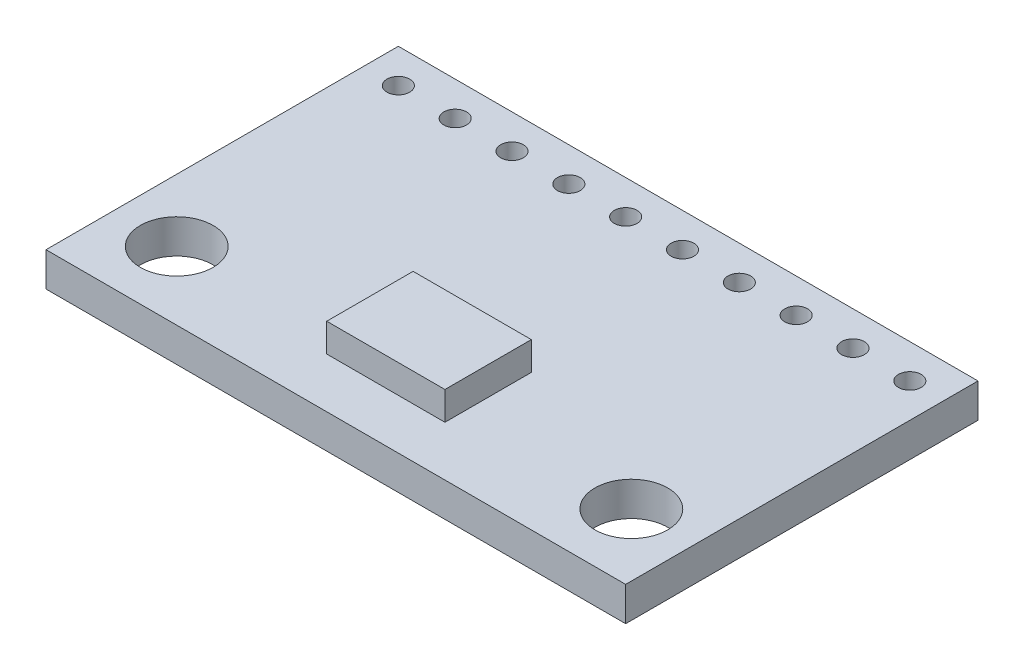
ISO-10303-21;
HEADER;
FILE_DESCRIPTION(('STEP AP214'),'2;1');
FILE_NAME('part.step','',(''),(''),'','','');
FILE_SCHEMA(('AUTOMOTIVE_DESIGN { 1 0 10303 214 1 1 1 1 }'));
ENDSEC;
DATA;
#1=APPLICATION_CONTEXT('core data for automotive mechanical design processes');
#2=APPLICATION_PROTOCOL_DEFINITION('international standard','automotive_design',2000,#1);
#3=PRODUCT_CONTEXT('',#1,'mechanical');
#4=PRODUCT('Part','Part','',(#3));
#5=PRODUCT_RELATED_PRODUCT_CATEGORY('part','',(#4));
#6=PRODUCT_DEFINITION_FORMATION('','',#4);
#7=PRODUCT_DEFINITION_CONTEXT('part definition',#1,'design');
#8=PRODUCT_DEFINITION('design','',#6,#7);
#9=PRODUCT_DEFINITION_SHAPE('','',#8);
#10=(LENGTH_UNIT() NAMED_UNIT(*) SI_UNIT(.MILLI.,.METRE.));
#11=(NAMED_UNIT(*) PLANE_ANGLE_UNIT() SI_UNIT($,.RADIAN.));
#12=(NAMED_UNIT(*) SI_UNIT($,.STERADIAN.) SOLID_ANGLE_UNIT());
#13=UNCERTAINTY_MEASURE_WITH_UNIT(LENGTH_MEASURE(1.E-05),#10,'distance_accuracy_value','');
#14=(GEOMETRIC_REPRESENTATION_CONTEXT(3) GLOBAL_UNCERTAINTY_ASSIGNED_CONTEXT((#13)) GLOBAL_UNIT_ASSIGNED_CONTEXT((#10,
#11,#12)) REPRESENTATION_CONTEXT('',''));
#15=CARTESIAN_POINT('',(0.,0.,0.));
#16=DIRECTION('',(0.,0.,1.));
#17=DIRECTION('',(1.,0.,0.));
#18=AXIS2_PLACEMENT_3D('',#15,#16,#17);
#19=CARTESIAN_POINT('',(0.,1.5,0.));
#20=DIRECTION('',(0.,1.,0.));
#21=DIRECTION('',(0.,0.,1.));
#22=AXIS2_PLACEMENT_3D('',#19,#20,#21);
#23=PLANE('',#22);
#24=CARTESIAN_POINT('',(11.25,1.5,-6.25));
#25=DIRECTION('',(0.,1.,0.));
#26=DIRECTION('',(0.,0.,1.));
#27=AXIS2_PLACEMENT_3D('',#24,#25,#26);
#28=CIRCLE('',#27,0.500000000000001);
#29=CARTESIAN_POINT('',(11.25,1.5,-5.75));
#30=VERTEX_POINT('',#29);
#31=EDGE_CURVE('E268',#30,#30,#28,.T.);
#32=ORIENTED_EDGE('',*,*,#31,.F.);
#33=EDGE_LOOP('',(#32));
#34=FACE_BOUND('',#33,.T.);
#35=CARTESIAN_POINT('',(8.75,1.5,-6.25));
#36=DIRECTION('',(0.,1.,0.));
#37=DIRECTION('',(0.,0.,1.));
#38=AXIS2_PLACEMENT_3D('',#35,#36,#37);
#39=CIRCLE('',#38,0.500000000000001);
#40=CARTESIAN_POINT('',(8.75,1.5,-5.75));
#41=VERTEX_POINT('',#40);
#42=EDGE_CURVE('E272',#41,#41,#39,.T.);
#43=ORIENTED_EDGE('',*,*,#42,.F.);
#44=EDGE_LOOP('',(#43));
#45=FACE_BOUND('',#44,.T.);
#46=CARTESIAN_POINT('',(6.25,1.5,-6.25));
#47=DIRECTION('',(0.,1.,0.));
#48=DIRECTION('',(0.,0.,1.));
#49=AXIS2_PLACEMENT_3D('',#46,#47,#48);
#50=CIRCLE('',#49,0.500000000000001);
#51=CARTESIAN_POINT('',(6.25,1.5,-5.75));
#52=VERTEX_POINT('',#51);
#53=EDGE_CURVE('E281',#52,#52,#50,.T.);
#54=ORIENTED_EDGE('',*,*,#53,.F.);
#55=EDGE_LOOP('',(#54));
#56=FACE_BOUND('',#55,.T.);
#57=CARTESIAN_POINT('',(3.75,1.5,-6.25));
#58=DIRECTION('',(0.,1.,0.));
#59=DIRECTION('',(0.,0.,1.));
#60=AXIS2_PLACEMENT_3D('',#57,#58,#59);
#61=CIRCLE('',#60,0.500000000000001);
#62=CARTESIAN_POINT('',(3.75,1.5,-5.75));
#63=VERTEX_POINT('',#62);
#64=EDGE_CURVE('E287',#63,#63,#61,.T.);
#65=ORIENTED_EDGE('',*,*,#64,.F.);
#66=EDGE_LOOP('',(#65));
#67=FACE_BOUND('',#66,.T.);
#68=CARTESIAN_POINT('',(1.25,1.5,-6.25));
#69=DIRECTION('',(0.,1.,0.));
#70=DIRECTION('',(0.,0.,1.));
#71=AXIS2_PLACEMENT_3D('',#68,#69,#70);
#72=CIRCLE('',#71,0.500000000000001);
#73=CARTESIAN_POINT('',(1.25,1.5,-5.75));
#74=VERTEX_POINT('',#73);
#75=EDGE_CURVE('E293',#74,#74,#72,.T.);
#76=ORIENTED_EDGE('',*,*,#75,.F.);
#77=EDGE_LOOP('',(#76));
#78=FACE_BOUND('',#77,.T.);
#79=CARTESIAN_POINT('',(-1.25,1.5,-6.25));
#80=DIRECTION('',(0.,1.,0.));
#81=DIRECTION('',(0.,0.,1.));
#82=AXIS2_PLACEMENT_3D('',#79,#80,#81);
#83=CIRCLE('',#82,0.500000000000001);
#84=CARTESIAN_POINT('',(-1.25,1.5,-5.75));
#85=VERTEX_POINT('',#84);
#86=EDGE_CURVE('E299',#85,#85,#83,.T.);
#87=ORIENTED_EDGE('',*,*,#86,.F.);
#88=EDGE_LOOP('',(#87));
#89=FACE_BOUND('',#88,.T.);
#90=CARTESIAN_POINT('',(-3.75,1.5,-6.25));
#91=DIRECTION('',(0.,1.,0.));
#92=DIRECTION('',(0.,0.,1.));
#93=AXIS2_PLACEMENT_3D('',#90,#91,#92);
#94=CIRCLE('',#93,0.500000000000001);
#95=CARTESIAN_POINT('',(-3.75,1.5,-5.75));
#96=VERTEX_POINT('',#95);
#97=EDGE_CURVE('E305',#96,#96,#94,.T.);
#98=ORIENTED_EDGE('',*,*,#97,.F.);
#99=EDGE_LOOP('',(#98));
#100=FACE_BOUND('',#99,.T.);
#101=CARTESIAN_POINT('',(-6.25,1.5,-6.25));
#102=DIRECTION('',(0.,1.,0.));
#103=DIRECTION('',(0.,0.,1.));
#104=AXIS2_PLACEMENT_3D('',#101,#102,#103);
#105=CIRCLE('',#104,0.500000000000001);
#106=CARTESIAN_POINT('',(-6.25,1.5,-5.75));
#107=VERTEX_POINT('',#106);
#108=EDGE_CURVE('E311',#107,#107,#105,.T.);
#109=ORIENTED_EDGE('',*,*,#108,.F.);
#110=EDGE_LOOP('',(#109));
#111=FACE_BOUND('',#110,.T.);
#112=CARTESIAN_POINT('',(-8.75,1.5,-6.25));
#113=DIRECTION('',(0.,1.,0.));
#114=DIRECTION('',(0.,0.,1.));
#115=AXIS2_PLACEMENT_3D('',#112,#113,#114);
#116=CIRCLE('',#115,0.500000000000001);
#117=CARTESIAN_POINT('',(-8.75,1.5,-5.75));
#118=VERTEX_POINT('',#117);
#119=EDGE_CURVE('E317',#118,#118,#116,.T.);
#120=ORIENTED_EDGE('',*,*,#119,.F.);
#121=EDGE_LOOP('',(#120));
#122=FACE_BOUND('',#121,.T.);
#123=CARTESIAN_POINT('',(-11.25,1.5,-6.25));
#124=DIRECTION('',(0.,1.,0.));
#125=DIRECTION('',(0.,0.,1.));
#126=AXIS2_PLACEMENT_3D('',#123,#124,#125);
#127=CIRCLE('',#126,0.500000000000001);
#128=CARTESIAN_POINT('',(-11.25,1.5,-5.75));
#129=VERTEX_POINT('',#128);
#130=EDGE_CURVE('E320',#129,#129,#127,.T.);
#131=ORIENTED_EDGE('',*,*,#130,.F.);
#132=EDGE_LOOP('',(#131));
#133=FACE_BOUND('',#132,.T.);
#134=CARTESIAN_POINT('',(-10.,1.5,4.75));
#135=DIRECTION('',(0.,1.,0.));
#136=DIRECTION('',(0.,0.,1.));
#137=AXIS2_PLACEMENT_3D('',#134,#135,#136);
#138=CIRCLE('',#137,1.6);
#139=CARTESIAN_POINT('',(-10.,1.5,6.35));
#140=VERTEX_POINT('',#139);
#141=EDGE_CURVE('E147',#140,#140,#138,.T.);
#142=ORIENTED_EDGE('',*,*,#141,.F.);
#143=EDGE_LOOP('',(#142));
#144=FACE_BOUND('',#143,.T.);
#145=DIRECTION('',(0.,0.,-1.));
#146=VECTOR('',#145,1.);
#147=CARTESIAN_POINT('',(12.75,1.5,-7.75));
#148=LINE('',#147,#146);
#149=CARTESIAN_POINT('',(12.75,1.5,7.75));
#150=VERTEX_POINT('',#149);
#151=CARTESIAN_POINT('',(12.75,1.5,-7.75));
#152=VERTEX_POINT('',#151);
#153=EDGE_CURVE('E153',#150,#152,#148,.T.);
#154=ORIENTED_EDGE('',*,*,#153,.T.);
#155=DIRECTION('',(-1.,0.,0.));
#156=VECTOR('',#155,1.);
#157=CARTESIAN_POINT('',(-12.75,1.5,-7.75));
#158=LINE('',#157,#156);
#159=CARTESIAN_POINT('',(-12.75,1.5,-7.75));
#160=VERTEX_POINT('',#159);
#161=EDGE_CURVE('E89',#152,#160,#158,.T.);
#162=ORIENTED_EDGE('',*,*,#161,.T.);
#163=DIRECTION('',(0.,0.,1.));
#164=VECTOR('',#163,1.);
#165=CARTESIAN_POINT('',(-12.75,1.5,-7.75));
#166=LINE('',#165,#164);
#167=CARTESIAN_POINT('',(-12.75,1.5,7.75));
#168=VERTEX_POINT('',#167);
#169=EDGE_CURVE('E156',#160,#168,#166,.T.);
#170=ORIENTED_EDGE('',*,*,#169,.T.);
#171=DIRECTION('',(1.,0.,0.));
#172=VECTOR('',#171,1.);
#173=CARTESIAN_POINT('',(-12.75,1.5,7.75));
#174=LINE('',#173,#172);
#175=EDGE_CURVE('E61',#168,#150,#174,.T.);
#176=ORIENTED_EDGE('',*,*,#175,.T.);
#177=EDGE_LOOP('',(#154,#162,#170,#176));
#178=FACE_BOUND('',#177,.T.);
#179=CARTESIAN_POINT('',(10.,1.5,4.75));
#180=DIRECTION('',(0.,1.,0.));
#181=DIRECTION('',(0.,0.,1.));
#182=AXIS2_PLACEMENT_3D('',#179,#180,#181);
#183=CIRCLE('',#182,1.6);
#184=CARTESIAN_POINT('',(10.,1.5,6.35));
#185=VERTEX_POINT('',#184);
#186=EDGE_CURVE('E139',#185,#185,#183,.T.);
#187=ORIENTED_EDGE('',*,*,#186,.F.);
#188=EDGE_LOOP('',(#187));
#189=FACE_BOUND('',#188,.T.);
#190=DIRECTION('',(-1.,0.,0.));
#191=VECTOR('',#190,1.);
#192=CARTESIAN_POINT('',(-2.6,1.5,1.75));
#193=LINE('',#192,#191);
#194=CARTESIAN_POINT('',(2.6,1.5,1.75));
#195=VERTEX_POINT('',#194);
#196=CARTESIAN_POINT('',(-2.6,1.5,1.75));
#197=VERTEX_POINT('',#196);
#198=EDGE_CURVE('E330',#195,#197,#193,.T.);
#199=ORIENTED_EDGE('',*,*,#198,.F.);
#200=DIRECTION('',(0.,0.,-1.));
#201=VECTOR('',#200,1.);
#202=CARTESIAN_POINT('',(2.6,1.5,1.75));
#203=LINE('',#202,#201);
#204=CARTESIAN_POINT('',(2.6,1.5,5.55));
#205=VERTEX_POINT('',#204);
#206=EDGE_CURVE('E134',#205,#195,#203,.T.);
#207=ORIENTED_EDGE('',*,*,#206,.F.);
#208=DIRECTION('',(1.,0.,0.));
#209=VECTOR('',#208,1.);
#210=CARTESIAN_POINT('',(-2.6,1.5,5.55));
#211=LINE('',#210,#209);
#212=CARTESIAN_POINT('',(-2.6,1.5,5.55));
#213=VERTEX_POINT('',#212);
#214=EDGE_CURVE('E130',#213,#205,#211,.T.);
#215=ORIENTED_EDGE('',*,*,#214,.F.);
#216=DIRECTION('',(0.,0.,1.));
#217=VECTOR('',#216,1.);
#218=CARTESIAN_POINT('',(-2.6,1.5,1.75));
#219=LINE('',#218,#217);
#220=EDGE_CURVE('E332',#197,#213,#219,.T.);
#221=ORIENTED_EDGE('',*,*,#220,.F.);
#222=EDGE_LOOP('',(#199,#207,#215,#221));
#223=FACE_BOUND('',#222,.T.);
#224=ADVANCED_FACE('F37',(#34,#45,#56,#67,#78,#89,#100,#111,#122,#133,#144,#178,#189,#223),#23,.T.);
#225=CARTESIAN_POINT('',(0.,0.,0.));
#226=DIRECTION('',(0.,1.,0.));
#227=DIRECTION('',(0.,0.,1.));
#228=AXIS2_PLACEMENT_3D('',#225,#226,#227);
#229=PLANE('',#228);
#230=CARTESIAN_POINT('',(11.25,0.,-6.25));
#231=DIRECTION('',(0.,1.,0.));
#232=DIRECTION('',(0.,0.,1.));
#233=AXIS2_PLACEMENT_3D('',#230,#231,#232);
#234=CIRCLE('',#233,0.500000000000001);
#235=CARTESIAN_POINT('',(11.25,0.,-5.75));
#236=VERTEX_POINT('',#235);
#237=EDGE_CURVE('E266',#236,#236,#234,.T.);
#238=ORIENTED_EDGE('',*,*,#237,.T.);
#239=EDGE_LOOP('',(#238));
#240=FACE_BOUND('',#239,.T.);
#241=CARTESIAN_POINT('',(8.75,0.,-6.25));
#242=DIRECTION('',(0.,1.,0.));
#243=DIRECTION('',(0.,0.,1.));
#244=AXIS2_PLACEMENT_3D('',#241,#242,#243);
#245=CIRCLE('',#244,0.500000000000001);
#246=CARTESIAN_POINT('',(8.75,0.,-5.75));
#247=VERTEX_POINT('',#246);
#248=EDGE_CURVE('E269',#247,#247,#245,.T.);
#249=ORIENTED_EDGE('',*,*,#248,.T.);
#250=EDGE_LOOP('',(#249));
#251=FACE_BOUND('',#250,.T.);
#252=CARTESIAN_POINT('',(6.25,0.,-6.25));
#253=DIRECTION('',(0.,1.,0.));
#254=DIRECTION('',(0.,0.,1.));
#255=AXIS2_PLACEMENT_3D('',#252,#253,#254);
#256=CIRCLE('',#255,0.500000000000001);
#257=CARTESIAN_POINT('',(6.25,0.,-5.75));
#258=VERTEX_POINT('',#257);
#259=EDGE_CURVE('E278',#258,#258,#256,.T.);
#260=ORIENTED_EDGE('',*,*,#259,.T.);
#261=EDGE_LOOP('',(#260));
#262=FACE_BOUND('',#261,.T.);
#263=CARTESIAN_POINT('',(3.75,0.,-6.25));
#264=DIRECTION('',(0.,1.,0.));
#265=DIRECTION('',(0.,0.,1.));
#266=AXIS2_PLACEMENT_3D('',#263,#264,#265);
#267=CIRCLE('',#266,0.500000000000001);
#268=CARTESIAN_POINT('',(3.75,0.,-5.75));
#269=VERTEX_POINT('',#268);
#270=EDGE_CURVE('E284',#269,#269,#267,.T.);
#271=ORIENTED_EDGE('',*,*,#270,.T.);
#272=EDGE_LOOP('',(#271));
#273=FACE_BOUND('',#272,.T.);
#274=CARTESIAN_POINT('',(1.25,0.,-6.25));
#275=DIRECTION('',(0.,1.,0.));
#276=DIRECTION('',(0.,0.,1.));
#277=AXIS2_PLACEMENT_3D('',#274,#275,#276);
#278=CIRCLE('',#277,0.500000000000001);
#279=CARTESIAN_POINT('',(1.25,0.,-5.75));
#280=VERTEX_POINT('',#279);
#281=EDGE_CURVE('E290',#280,#280,#278,.T.);
#282=ORIENTED_EDGE('',*,*,#281,.T.);
#283=EDGE_LOOP('',(#282));
#284=FACE_BOUND('',#283,.T.);
#285=CARTESIAN_POINT('',(-1.25,0.,-6.25));
#286=DIRECTION('',(0.,1.,0.));
#287=DIRECTION('',(0.,0.,1.));
#288=AXIS2_PLACEMENT_3D('',#285,#286,#287);
#289=CIRCLE('',#288,0.500000000000001);
#290=CARTESIAN_POINT('',(-1.25,0.,-5.75));
#291=VERTEX_POINT('',#290);
#292=EDGE_CURVE('E296',#291,#291,#289,.T.);
#293=ORIENTED_EDGE('',*,*,#292,.T.);
#294=EDGE_LOOP('',(#293));
#295=FACE_BOUND('',#294,.T.);
#296=CARTESIAN_POINT('',(-3.75,0.,-6.25));
#297=DIRECTION('',(0.,1.,0.));
#298=DIRECTION('',(0.,0.,1.));
#299=AXIS2_PLACEMENT_3D('',#296,#297,#298);
#300=CIRCLE('',#299,0.500000000000001);
#301=CARTESIAN_POINT('',(-3.75,0.,-5.75));
#302=VERTEX_POINT('',#301);
#303=EDGE_CURVE('E302',#302,#302,#300,.T.);
#304=ORIENTED_EDGE('',*,*,#303,.T.);
#305=EDGE_LOOP('',(#304));
#306=FACE_BOUND('',#305,.T.);
#307=CARTESIAN_POINT('',(-6.25,0.,-6.25));
#308=DIRECTION('',(0.,1.,0.));
#309=DIRECTION('',(0.,0.,1.));
#310=AXIS2_PLACEMENT_3D('',#307,#308,#309);
#311=CIRCLE('',#310,0.500000000000001);
#312=CARTESIAN_POINT('',(-6.25,0.,-5.75));
#313=VERTEX_POINT('',#312);
#314=EDGE_CURVE('E308',#313,#313,#311,.T.);
#315=ORIENTED_EDGE('',*,*,#314,.T.);
#316=EDGE_LOOP('',(#315));
#317=FACE_BOUND('',#316,.T.);
#318=CARTESIAN_POINT('',(-8.75,0.,-6.25));
#319=DIRECTION('',(0.,1.,0.));
#320=DIRECTION('',(0.,0.,1.));
#321=AXIS2_PLACEMENT_3D('',#318,#319,#320);
#322=CIRCLE('',#321,0.500000000000001);
#323=CARTESIAN_POINT('',(-8.75,0.,-5.75));
#324=VERTEX_POINT('',#323);
#325=EDGE_CURVE('E314',#324,#324,#322,.T.);
#326=ORIENTED_EDGE('',*,*,#325,.T.);
#327=EDGE_LOOP('',(#326));
#328=FACE_BOUND('',#327,.T.);
#329=CARTESIAN_POINT('',(-11.25,0.,-6.25));
#330=DIRECTION('',(0.,1.,0.));
#331=DIRECTION('',(0.,0.,1.));
#332=AXIS2_PLACEMENT_3D('',#329,#330,#331);
#333=CIRCLE('',#332,0.500000000000001);
#334=CARTESIAN_POINT('',(-11.25,0.,-5.75));
#335=VERTEX_POINT('',#334);
#336=EDGE_CURVE('E321',#335,#335,#333,.T.);
#337=ORIENTED_EDGE('',*,*,#336,.T.);
#338=EDGE_LOOP('',(#337));
#339=FACE_BOUND('',#338,.T.);
#340=DIRECTION('',(0.,0.,-1.));
#341=VECTOR('',#340,1.);
#342=CARTESIAN_POINT('',(12.75,0.,-7.75));
#343=LINE('',#342,#341);
#344=CARTESIAN_POINT('',(12.75,0.,7.75));
#345=VERTEX_POINT('',#344);
#346=CARTESIAN_POINT('',(12.75,0.,-7.75));
#347=VERTEX_POINT('',#346);
#348=EDGE_CURVE('E150',#345,#347,#343,.T.);
#349=ORIENTED_EDGE('',*,*,#348,.F.);
#350=DIRECTION('',(1.,0.,0.));
#351=VECTOR('',#350,1.);
#352=CARTESIAN_POINT('',(-12.75,0.,7.75));
#353=LINE('',#352,#351);
#354=CARTESIAN_POINT('',(-12.75,0.,7.75));
#355=VERTEX_POINT('',#354);
#356=EDGE_CURVE('E82',#355,#345,#353,.T.);
#357=ORIENTED_EDGE('',*,*,#356,.F.);
#358=DIRECTION('',(0.,0.,1.));
#359=VECTOR('',#358,1.);
#360=CARTESIAN_POINT('',(-12.75,0.,-7.75));
#361=LINE('',#360,#359);
#362=CARTESIAN_POINT('',(-12.75,0.,-7.75));
#363=VERTEX_POINT('',#362);
#364=EDGE_CURVE('E164',#363,#355,#361,.T.);
#365=ORIENTED_EDGE('',*,*,#364,.F.);
#366=DIRECTION('',(-1.,0.,0.));
#367=VECTOR('',#366,1.);
#368=CARTESIAN_POINT('',(-12.75,0.,-7.75));
#369=LINE('',#368,#367);
#370=EDGE_CURVE('E162',#347,#363,#369,.T.);
#371=ORIENTED_EDGE('',*,*,#370,.F.);
#372=EDGE_LOOP('',(#349,#357,#365,#371));
#373=FACE_BOUND('',#372,.T.);
#374=CARTESIAN_POINT('',(-10.,0.,4.75));
#375=DIRECTION('',(0.,1.,0.));
#376=DIRECTION('',(0.,0.,1.));
#377=AXIS2_PLACEMENT_3D('',#374,#375,#376);
#378=CIRCLE('',#377,1.6);
#379=CARTESIAN_POINT('',(-10.,0.,6.35));
#380=VERTEX_POINT('',#379);
#381=EDGE_CURVE('E145',#380,#380,#378,.T.);
#382=ORIENTED_EDGE('',*,*,#381,.T.);
#383=EDGE_LOOP('',(#382));
#384=FACE_BOUND('',#383,.T.);
#385=CARTESIAN_POINT('',(10.,0.,4.75));
#386=DIRECTION('',(0.,1.,0.));
#387=DIRECTION('',(0.,0.,1.));
#388=AXIS2_PLACEMENT_3D('',#385,#386,#387);
#389=CIRCLE('',#388,1.6);
#390=CARTESIAN_POINT('',(10.,0.,6.35));
#391=VERTEX_POINT('',#390);
#392=EDGE_CURVE('E136',#391,#391,#389,.T.);
#393=ORIENTED_EDGE('',*,*,#392,.T.);
#394=EDGE_LOOP('',(#393));
#395=FACE_BOUND('',#394,.T.);
#396=ADVANCED_FACE('F177',(#240,#251,#262,#273,#284,#295,#306,#317,#328,#339,#373,#384,#395),
#229,.F.);
#397=CARTESIAN_POINT('',(12.75,1.5,-7.75));
#398=DIRECTION('',(-1.,0.,0.));
#399=DIRECTION('',(0.,0.,1.));
#400=AXIS2_PLACEMENT_3D('',#397,#398,#399);
#401=PLANE('',#400);
#402=ORIENTED_EDGE('',*,*,#348,.T.);
#403=DIRECTION('',(0.,-1.,0.));
#404=VECTOR('',#403,1.);
#405=CARTESIAN_POINT('',(12.75,1.5,-7.75));
#406=LINE('',#405,#404);
#407=EDGE_CURVE('E11',#152,#347,#406,.T.);
#408=ORIENTED_EDGE('',*,*,#407,.F.);
#409=ORIENTED_EDGE('',*,*,#153,.F.);
#410=DIRECTION('',(0.,-1.,0.));
#411=VECTOR('',#410,1.);
#412=CARTESIAN_POINT('',(12.75,1.5,7.75));
#413=LINE('',#412,#411);
#414=EDGE_CURVE('E159',#150,#345,#413,.T.);
#415=ORIENTED_EDGE('',*,*,#414,.T.);
#416=EDGE_LOOP('',(#402,#408,#409,#415));
#417=FACE_BOUND('',#416,.T.);
#418=ADVANCED_FACE('F39',(#417),#401,.F.);
#419=CARTESIAN_POINT('',(-12.75,1.5,-7.75));
#420=DIRECTION('',(0.,0.,1.));
#421=DIRECTION('',(1.,0.,0.));
#422=AXIS2_PLACEMENT_3D('',#419,#420,#421);
#423=PLANE('',#422);
#424=ORIENTED_EDGE('',*,*,#370,.T.);
#425=DIRECTION('',(0.,-1.,0.));
#426=VECTOR('',#425,1.);
#427=CARTESIAN_POINT('',(-12.75,1.5,-7.75));
#428=LINE('',#427,#426);
#429=EDGE_CURVE('E45',#160,#363,#428,.T.);
#430=ORIENTED_EDGE('',*,*,#429,.F.);
#431=ORIENTED_EDGE('',*,*,#161,.F.);
#432=ORIENTED_EDGE('',*,*,#407,.T.);
#433=EDGE_LOOP('',(#424,#430,#431,#432));
#434=FACE_BOUND('',#433,.T.);
#435=ADVANCED_FACE('F193',(#434),#423,.F.);
#436=CARTESIAN_POINT('',(-12.75,1.5,-7.75));
#437=DIRECTION('',(1.,0.,0.));
#438=DIRECTION('',(0.,0.,-1.));
#439=AXIS2_PLACEMENT_3D('',#436,#437,#438);
#440=PLANE('',#439);
#441=ORIENTED_EDGE('',*,*,#364,.T.);
#442=DIRECTION('',(0.,-1.,0.));
#443=VECTOR('',#442,1.);
#444=CARTESIAN_POINT('',(-12.75,1.5,7.75));
#445=LINE('',#444,#443);
#446=EDGE_CURVE('E168',#168,#355,#445,.T.);
#447=ORIENTED_EDGE('',*,*,#446,.F.);
#448=ORIENTED_EDGE('',*,*,#169,.F.);
#449=ORIENTED_EDGE('',*,*,#429,.T.);
#450=EDGE_LOOP('',(#441,#447,#448,#449));
#451=FACE_BOUND('',#450,.T.);
#452=ADVANCED_FACE('F173',(#451),#440,.F.);
#453=CARTESIAN_POINT('',(-12.75,1.5,7.75));
#454=DIRECTION('',(0.,0.,-1.));
#455=DIRECTION('',(-1.,0.,0.));
#456=AXIS2_PLACEMENT_3D('',#453,#454,#455);
#457=PLANE('',#456);
#458=ORIENTED_EDGE('',*,*,#356,.T.);
#459=ORIENTED_EDGE('',*,*,#414,.F.);
#460=ORIENTED_EDGE('',*,*,#175,.F.);
#461=ORIENTED_EDGE('',*,*,#446,.T.);
#462=EDGE_LOOP('',(#458,#459,#460,#461));
#463=FACE_BOUND('',#462,.T.);
#464=ADVANCED_FACE('F182',(#463),#457,.F.);
#465=CARTESIAN_POINT('',(-10.,1.5,4.75));
#466=DIRECTION('',(0.,-1.,0.));
#467=DIRECTION('',(0.,0.,-1.));
#468=AXIS2_PLACEMENT_3D('',#465,#466,#467);
#469=CYLINDRICAL_SURFACE('',#468,1.6);
#470=ORIENTED_EDGE('',*,*,#141,.T.);
#471=EDGE_LOOP('',(#470));
#472=FACE_BOUND('',#471,.T.);
#473=ORIENTED_EDGE('',*,*,#381,.F.);
#474=EDGE_LOOP('',(#473));
#475=FACE_BOUND('',#474,.T.);
#476=ADVANCED_FACE('F184',(#472,#475),#469,.F.);
#477=CARTESIAN_POINT('',(10.,1.5,4.75));
#478=DIRECTION('',(0.,-1.,0.));
#479=DIRECTION('',(0.,0.,-1.));
#480=AXIS2_PLACEMENT_3D('',#477,#478,#479);
#481=CYLINDRICAL_SURFACE('',#480,1.6);
#482=ORIENTED_EDGE('',*,*,#186,.T.);
#483=EDGE_LOOP('',(#482));
#484=FACE_BOUND('',#483,.T.);
#485=ORIENTED_EDGE('',*,*,#392,.F.);
#486=EDGE_LOOP('',(#485));
#487=FACE_BOUND('',#486,.T.);
#488=ADVANCED_FACE('F190',(#484,#487),#481,.F.);
#489=CARTESIAN_POINT('',(2.6,2.75,1.75));
#490=DIRECTION('',(-1.,0.,0.));
#491=DIRECTION('',(0.,0.,1.));
#492=AXIS2_PLACEMENT_3D('',#489,#490,#491);
#493=PLANE('',#492);
#494=ORIENTED_EDGE('',*,*,#206,.T.);
#495=DIRECTION('',(0.,-1.,0.));
#496=VECTOR('',#495,1.);
#497=CARTESIAN_POINT('',(2.6,2.75,1.75));
#498=LINE('',#497,#496);
#499=CARTESIAN_POINT('',(2.6,2.75,1.75));
#500=VERTEX_POINT('',#499);
#501=EDGE_CURVE('E115',#500,#195,#498,.T.);
#502=ORIENTED_EDGE('',*,*,#501,.F.);
#503=DIRECTION('',(0.,0.,-1.));
#504=VECTOR('',#503,1.);
#505=CARTESIAN_POINT('',(2.6,2.75,1.75));
#506=LINE('',#505,#504);
#507=CARTESIAN_POINT('',(2.6,2.75,5.55));
#508=VERTEX_POINT('',#507);
#509=EDGE_CURVE('E122',#508,#500,#506,.T.);
#510=ORIENTED_EDGE('',*,*,#509,.F.);
#511=DIRECTION('',(0.,-1.,0.));
#512=VECTOR('',#511,1.);
#513=CARTESIAN_POINT('',(2.6,2.75,5.55));
#514=LINE('',#513,#512);
#515=EDGE_CURVE('E328',#508,#205,#514,.T.);
#516=ORIENTED_EDGE('',*,*,#515,.T.);
#517=EDGE_LOOP('',(#494,#502,#510,#516));
#518=FACE_BOUND('',#517,.T.);
#519=ADVANCED_FACE('F132',(#518),#493,.F.);
#520=CARTESIAN_POINT('',(-2.6,2.75,1.75));
#521=DIRECTION('',(0.,0.,1.));
#522=DIRECTION('',(1.,0.,0.));
#523=AXIS2_PLACEMENT_3D('',#520,#521,#522);
#524=PLANE('',#523);
#525=ORIENTED_EDGE('',*,*,#198,.T.);
#526=DIRECTION('',(0.,-1.,0.));
#527=VECTOR('',#526,1.);
#528=CARTESIAN_POINT('',(-2.6,2.75,1.75));
#529=LINE('',#528,#527);
#530=CARTESIAN_POINT('',(-2.6,2.75,1.75));
#531=VERTEX_POINT('',#530);
#532=EDGE_CURVE('E118',#531,#197,#529,.T.);
#533=ORIENTED_EDGE('',*,*,#532,.F.);
#534=DIRECTION('',(-1.,0.,0.));
#535=VECTOR('',#534,1.);
#536=CARTESIAN_POINT('',(-2.6,2.75,1.75));
#537=LINE('',#536,#535);
#538=EDGE_CURVE('E111',#500,#531,#537,.T.);
#539=ORIENTED_EDGE('',*,*,#538,.F.);
#540=ORIENTED_EDGE('',*,*,#501,.T.);
#541=EDGE_LOOP('',(#525,#533,#539,#540));
#542=FACE_BOUND('',#541,.T.);
#543=ADVANCED_FACE('F113',(#542),#524,.F.);
#544=CARTESIAN_POINT('',(-2.6,2.75,1.75));
#545=DIRECTION('',(1.,0.,0.));
#546=DIRECTION('',(0.,0.,-1.));
#547=AXIS2_PLACEMENT_3D('',#544,#545,#546);
#548=PLANE('',#547);
#549=ORIENTED_EDGE('',*,*,#220,.T.);
#550=DIRECTION('',(0.,-1.,0.));
#551=VECTOR('',#550,1.);
#552=CARTESIAN_POINT('',(-2.6,2.75,5.55));
#553=LINE('',#552,#551);
#554=CARTESIAN_POINT('',(-2.6,2.75,5.55));
#555=VERTEX_POINT('',#554);
#556=EDGE_CURVE('E52',#555,#213,#553,.T.);
#557=ORIENTED_EDGE('',*,*,#556,.F.);
#558=DIRECTION('',(0.,0.,1.));
#559=VECTOR('',#558,1.);
#560=CARTESIAN_POINT('',(-2.6,2.75,1.75));
#561=LINE('',#560,#559);
#562=EDGE_CURVE('E121',#531,#555,#561,.T.);
#563=ORIENTED_EDGE('',*,*,#562,.F.);
#564=ORIENTED_EDGE('',*,*,#532,.T.);
#565=EDGE_LOOP('',(#549,#557,#563,#564));
#566=FACE_BOUND('',#565,.T.);
#567=ADVANCED_FACE('F213',(#566),#548,.F.);
#568=CARTESIAN_POINT('',(-2.6,2.75,5.55));
#569=DIRECTION('',(0.,0.,-1.));
#570=DIRECTION('',(-1.,0.,0.));
#571=AXIS2_PLACEMENT_3D('',#568,#569,#570);
#572=PLANE('',#571);
#573=ORIENTED_EDGE('',*,*,#214,.T.);
#574=ORIENTED_EDGE('',*,*,#515,.F.);
#575=DIRECTION('',(1.,0.,0.));
#576=VECTOR('',#575,1.);
#577=CARTESIAN_POINT('',(-2.6,2.75,5.55));
#578=LINE('',#577,#576);
#579=EDGE_CURVE('E126',#555,#508,#578,.T.);
#580=ORIENTED_EDGE('',*,*,#579,.F.);
#581=ORIENTED_EDGE('',*,*,#556,.T.);
#582=EDGE_LOOP('',(#573,#574,#580,#581));
#583=FACE_BOUND('',#582,.T.);
#584=ADVANCED_FACE('F216',(#583),#572,.F.);
#585=CARTESIAN_POINT('',(0.,2.75,0.));
#586=DIRECTION('',(0.,1.,0.));
#587=DIRECTION('',(0.,0.,1.));
#588=AXIS2_PLACEMENT_3D('',#585,#586,#587);
#589=PLANE('',#588);
#590=ORIENTED_EDGE('',*,*,#509,.T.);
#591=ORIENTED_EDGE('',*,*,#538,.T.);
#592=ORIENTED_EDGE('',*,*,#562,.T.);
#593=ORIENTED_EDGE('',*,*,#579,.T.);
#594=EDGE_LOOP('',(#590,#591,#592,#593));
#595=FACE_BOUND('',#594,.T.);
#596=ADVANCED_FACE('F125',(#595),#589,.T.);
#597=CARTESIAN_POINT('',(-11.25,0.,-6.25));
#598=DIRECTION('',(0.,1.,0.));
#599=DIRECTION('',(0.,0.,1.));
#600=AXIS2_PLACEMENT_3D('',#597,#598,#599);
#601=CYLINDRICAL_SURFACE('',#600,0.500000000000001);
#602=ORIENTED_EDGE('',*,*,#336,.F.);
#603=EDGE_LOOP('',(#602));
#604=FACE_BOUND('',#603,.T.);
#605=ORIENTED_EDGE('',*,*,#130,.T.);
#606=EDGE_LOOP('',(#605));
#607=FACE_BOUND('',#606,.T.);
#608=ADVANCED_FACE('F222',(#604,#607),#601,.F.);
#609=CARTESIAN_POINT('',(-8.75,0.,-6.25));
#610=DIRECTION('',(0.,1.,0.));
#611=DIRECTION('',(0.,0.,1.));
#612=AXIS2_PLACEMENT_3D('',#609,#610,#611);
#613=CYLINDRICAL_SURFACE('',#612,0.500000000000001);
#614=ORIENTED_EDGE('',*,*,#325,.F.);
#615=EDGE_LOOP('',(#614));
#616=FACE_BOUND('',#615,.T.);
#617=ORIENTED_EDGE('',*,*,#119,.T.);
#618=EDGE_LOOP('',(#617));
#619=FACE_BOUND('',#618,.T.);
#620=ADVANCED_FACE('F225',(#616,#619),#613,.F.);
#621=CARTESIAN_POINT('',(-6.25,0.,-6.25));
#622=DIRECTION('',(0.,1.,0.));
#623=DIRECTION('',(0.,0.,1.));
#624=AXIS2_PLACEMENT_3D('',#621,#622,#623);
#625=CYLINDRICAL_SURFACE('',#624,0.500000000000001);
#626=ORIENTED_EDGE('',*,*,#314,.F.);
#627=EDGE_LOOP('',(#626));
#628=FACE_BOUND('',#627,.T.);
#629=ORIENTED_EDGE('',*,*,#108,.T.);
#630=EDGE_LOOP('',(#629));
#631=FACE_BOUND('',#630,.T.);
#632=ADVANCED_FACE('F229',(#628,#631),#625,.F.);
#633=CARTESIAN_POINT('',(-3.75,0.,-6.25));
#634=DIRECTION('',(0.,1.,0.));
#635=DIRECTION('',(0.,0.,1.));
#636=AXIS2_PLACEMENT_3D('',#633,#634,#635);
#637=CYLINDRICAL_SURFACE('',#636,0.500000000000001);
#638=ORIENTED_EDGE('',*,*,#303,.F.);
#639=EDGE_LOOP('',(#638));
#640=FACE_BOUND('',#639,.T.);
#641=ORIENTED_EDGE('',*,*,#97,.T.);
#642=EDGE_LOOP('',(#641));
#643=FACE_BOUND('',#642,.T.);
#644=ADVANCED_FACE('F233',(#640,#643),#637,.F.);
#645=CARTESIAN_POINT('',(-1.25,0.,-6.25));
#646=DIRECTION('',(0.,1.,0.));
#647=DIRECTION('',(0.,0.,1.));
#648=AXIS2_PLACEMENT_3D('',#645,#646,#647);
#649=CYLINDRICAL_SURFACE('',#648,0.500000000000001);
#650=ORIENTED_EDGE('',*,*,#292,.F.);
#651=EDGE_LOOP('',(#650));
#652=FACE_BOUND('',#651,.T.);
#653=ORIENTED_EDGE('',*,*,#86,.T.);
#654=EDGE_LOOP('',(#653));
#655=FACE_BOUND('',#654,.T.);
#656=ADVANCED_FACE('F237',(#652,#655),#649,.F.);
#657=CARTESIAN_POINT('',(1.25,0.,-6.25));
#658=DIRECTION('',(0.,1.,0.));
#659=DIRECTION('',(0.,0.,1.));
#660=AXIS2_PLACEMENT_3D('',#657,#658,#659);
#661=CYLINDRICAL_SURFACE('',#660,0.500000000000001);
#662=ORIENTED_EDGE('',*,*,#281,.F.);
#663=EDGE_LOOP('',(#662));
#664=FACE_BOUND('',#663,.T.);
#665=ORIENTED_EDGE('',*,*,#75,.T.);
#666=EDGE_LOOP('',(#665));
#667=FACE_BOUND('',#666,.T.);
#668=ADVANCED_FACE('F241',(#664,#667),#661,.F.);
#669=CARTESIAN_POINT('',(3.75,0.,-6.25));
#670=DIRECTION('',(0.,1.,0.));
#671=DIRECTION('',(0.,0.,1.));
#672=AXIS2_PLACEMENT_3D('',#669,#670,#671);
#673=CYLINDRICAL_SURFACE('',#672,0.500000000000001);
#674=ORIENTED_EDGE('',*,*,#270,.F.);
#675=EDGE_LOOP('',(#674));
#676=FACE_BOUND('',#675,.T.);
#677=ORIENTED_EDGE('',*,*,#64,.T.);
#678=EDGE_LOOP('',(#677));
#679=FACE_BOUND('',#678,.T.);
#680=ADVANCED_FACE('F245',(#676,#679),#673,.F.);
#681=CARTESIAN_POINT('',(6.25,0.,-6.25));
#682=DIRECTION('',(0.,1.,0.));
#683=DIRECTION('',(0.,0.,1.));
#684=AXIS2_PLACEMENT_3D('',#681,#682,#683);
#685=CYLINDRICAL_SURFACE('',#684,0.500000000000001);
#686=ORIENTED_EDGE('',*,*,#259,.F.);
#687=EDGE_LOOP('',(#686));
#688=FACE_BOUND('',#687,.T.);
#689=ORIENTED_EDGE('',*,*,#53,.T.);
#690=EDGE_LOOP('',(#689));
#691=FACE_BOUND('',#690,.T.);
#692=ADVANCED_FACE('F249',(#688,#691),#685,.F.);
#693=CARTESIAN_POINT('',(8.75,0.,-6.25));
#694=DIRECTION('',(0.,1.,0.));
#695=DIRECTION('',(0.,0.,1.));
#696=AXIS2_PLACEMENT_3D('',#693,#694,#695);
#697=CYLINDRICAL_SURFACE('',#696,0.500000000000001);
#698=ORIENTED_EDGE('',*,*,#248,.F.);
#699=EDGE_LOOP('',(#698));
#700=FACE_BOUND('',#699,.T.);
#701=ORIENTED_EDGE('',*,*,#42,.T.);
#702=EDGE_LOOP('',(#701));
#703=FACE_BOUND('',#702,.T.);
#704=ADVANCED_FACE('F253',(#700,#703),#697,.F.);
#705=CARTESIAN_POINT('',(11.25,0.,-6.25));
#706=DIRECTION('',(0.,1.,0.));
#707=DIRECTION('',(0.,0.,1.));
#708=AXIS2_PLACEMENT_3D('',#705,#706,#707);
#709=CYLINDRICAL_SURFACE('',#708,0.500000000000001);
#710=ORIENTED_EDGE('',*,*,#237,.F.);
#711=EDGE_LOOP('',(#710));
#712=FACE_BOUND('',#711,.T.);
#713=ORIENTED_EDGE('',*,*,#31,.T.);
#714=EDGE_LOOP('',(#713));
#715=FACE_BOUND('',#714,.T.);
#716=ADVANCED_FACE('F257',(#712,#715),#709,.F.);
#717=CLOSED_SHELL('',(#224,#396,#418,#435,#452,#464,#476,#488,#519,#543,#567,#584,#596,#608,
#620,#632,#644,#656,#668,#680,#692,#704,#716));
#718=MANIFOLD_SOLID_BREP('B2',#717);
#719=ADVANCED_BREP_SHAPE_REPRESENTATION('',(#18,#718),#14);
#720=SHAPE_DEFINITION_REPRESENTATION(#9,#719);
ENDSEC;
END-ISO-10303-21;
